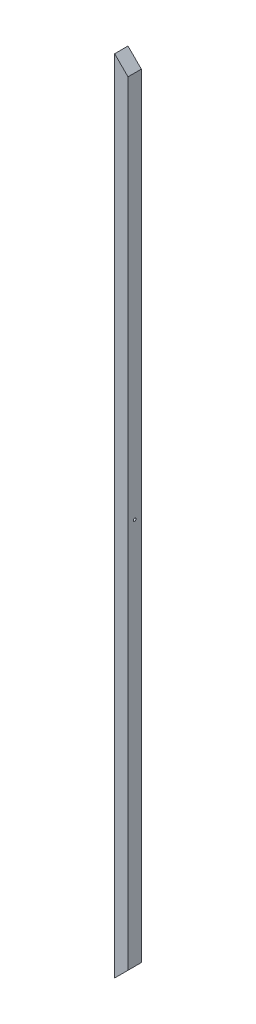
ISO-10303-21;
HEADER;
FILE_DESCRIPTION(('STEP AP214'),'2;1');
FILE_NAME('part.step','',(''),(''),'','','');
FILE_SCHEMA(('AUTOMOTIVE_DESIGN { 1 0 10303 214 1 1 1 1 }'));
ENDSEC;
DATA;
#1=APPLICATION_CONTEXT('core data for automotive mechanical design processes');
#2=APPLICATION_PROTOCOL_DEFINITION('international standard','automotive_design',2000,#1);
#3=PRODUCT_CONTEXT('',#1,'mechanical');
#4=PRODUCT('Part','Part','',(#3));
#5=PRODUCT_RELATED_PRODUCT_CATEGORY('part','',(#4));
#6=PRODUCT_DEFINITION_FORMATION('','',#4);
#7=PRODUCT_DEFINITION_CONTEXT('part definition',#1,'design');
#8=PRODUCT_DEFINITION('design','',#6,#7);
#9=PRODUCT_DEFINITION_SHAPE('','',#8);
#10=(LENGTH_UNIT() NAMED_UNIT(*) SI_UNIT(.MILLI.,.METRE.));
#11=(NAMED_UNIT(*) PLANE_ANGLE_UNIT() SI_UNIT($,.RADIAN.));
#12=(NAMED_UNIT(*) SI_UNIT($,.STERADIAN.) SOLID_ANGLE_UNIT());
#13=UNCERTAINTY_MEASURE_WITH_UNIT(LENGTH_MEASURE(1.E-05),#10,'distance_accuracy_value','');
#14=(GEOMETRIC_REPRESENTATION_CONTEXT(3) GLOBAL_UNCERTAINTY_ASSIGNED_CONTEXT((#13)) GLOBAL_UNIT_ASSIGNED_CONTEXT((#10,
#11,#12)) REPRESENTATION_CONTEXT('',''));
#15=CARTESIAN_POINT('',(0.,0.,0.));
#16=DIRECTION('',(0.,0.,1.));
#17=DIRECTION('',(1.,0.,0.));
#18=AXIS2_PLACEMENT_3D('',#15,#16,#17);
#19=CARTESIAN_POINT('',(-25.,3000.,-25.));
#20=DIRECTION('',(1.,0.,0.));
#21=DIRECTION('',(0.,0.,-1.));
#22=AXIS2_PLACEMENT_3D('',#19,#20,#21);
#23=PLANE('',#22);
#24=CARTESIAN_POINT('',(-25.,1500.,0.));
#25=DIRECTION('',(-1.,0.,0.));
#26=DIRECTION('',(0.,0.,1.));
#27=AXIS2_PLACEMENT_3D('',#24,#25,#26);
#28=CIRCLE('',#27,5.);
#29=CARTESIAN_POINT('',(-25.,1500.,5.));
#30=VERTEX_POINT('',#29);
#31=EDGE_CURVE('E137',#30,#30,#28,.T.);
#32=ORIENTED_EDGE('',*,*,#31,.F.);
#33=EDGE_LOOP('',(#32));
#34=FACE_BOUND('',#33,.T.);
#35=DIRECTION('',(0.,0.,1.));
#36=VECTOR('',#35,1.);
#37=CARTESIAN_POINT('',(-25.,0.,-25.));
#38=LINE('',#37,#36);
#39=CARTESIAN_POINT('',(-25.,0.,-24.9999999999999));
#40=VERTEX_POINT('',#39);
#41=CARTESIAN_POINT('',(-25.,0.,25.));
#42=VERTEX_POINT('',#41);
#43=EDGE_CURVE('E85',#40,#42,#38,.T.);
#44=ORIENTED_EDGE('',*,*,#43,.T.);
#45=DIRECTION('',(0.,-1.,0.));
#46=VECTOR('',#45,1.);
#47=CARTESIAN_POINT('',(-25.,3000.,25.));
#48=LINE('',#47,#46);
#49=CARTESIAN_POINT('',(-25.,3000.,25.));
#50=VERTEX_POINT('',#49);
#51=EDGE_CURVE('E11',#50,#42,#48,.T.);
#52=ORIENTED_EDGE('',*,*,#51,.F.);
#53=DIRECTION('',(0.,0.,1.));
#54=VECTOR('',#53,1.);
#55=CARTESIAN_POINT('',(-25.,3000.,-25.));
#56=LINE('',#55,#54);
#57=CARTESIAN_POINT('',(-25.,3000.,-25.));
#58=VERTEX_POINT('',#57);
#59=EDGE_CURVE('E76',#58,#50,#56,.T.);
#60=ORIENTED_EDGE('',*,*,#59,.F.);
#61=DIRECTION('',(0.,-1.,0.));
#62=VECTOR('',#61,1.);
#63=CARTESIAN_POINT('',(-25.,3000.,-25.));
#64=LINE('',#63,#62);
#65=EDGE_CURVE('E84',#58,#40,#64,.T.);
#66=ORIENTED_EDGE('',*,*,#65,.T.);
#67=EDGE_LOOP('',(#44,#52,#60,#66));
#68=FACE_BOUND('',#67,.T.);
#69=ADVANCED_FACE('F42',(#34,#68),#23,.F.);
#70=CARTESIAN_POINT('',(25.,3000.,25.));
#71=DIRECTION('',(0.,0.,-1.));
#72=DIRECTION('',(-1.,0.,0.));
#73=AXIS2_PLACEMENT_3D('',#70,#71,#72);
#74=PLANE('',#73);
#75=DIRECTION('',(0.,-1.,0.));
#76=VECTOR('',#75,1.);
#77=CARTESIAN_POINT('',(25.,3000.,25.));
#78=LINE('',#77,#76);
#79=CARTESIAN_POINT('',(25.,2950.,25.));
#80=VERTEX_POINT('',#79);
#81=CARTESIAN_POINT('',(25.0000000000002,50.0000000000006,25.));
#82=VERTEX_POINT('',#81);
#83=EDGE_CURVE('E50',#80,#82,#78,.T.);
#84=ORIENTED_EDGE('',*,*,#83,.F.);
#85=DIRECTION('',(0.707106781186552,-0.707106781186543,0.));
#86=VECTOR('',#85,1.);
#87=CARTESIAN_POINT('',(-25.,3000.,25.));
#88=LINE('',#87,#86);
#89=EDGE_CURVE('E79',#50,#80,#88,.T.);
#90=ORIENTED_EDGE('',*,*,#89,.F.);
#91=ORIENTED_EDGE('',*,*,#51,.T.);
#92=DIRECTION('',(-0.707106781186544,-0.707106781186551,0.));
#93=VECTOR('',#92,1.);
#94=CARTESIAN_POINT('',(-25.,0.,25.));
#95=LINE('',#94,#93);
#96=EDGE_CURVE('E94',#82,#42,#95,.T.);
#97=ORIENTED_EDGE('',*,*,#96,.F.);
#98=EDGE_LOOP('',(#84,#90,#91,#97));
#99=FACE_BOUND('',#98,.T.);
#100=ADVANCED_FACE('F89',(#99),#74,.F.);
#101=CARTESIAN_POINT('',(25.,3000.,-25.));
#102=DIRECTION('',(-1.,0.,0.));
#103=DIRECTION('',(0.,0.,1.));
#104=AXIS2_PLACEMENT_3D('',#101,#102,#103);
#105=PLANE('',#104);
#106=CARTESIAN_POINT('',(25.,1500.,0.));
#107=DIRECTION('',(-1.,0.,0.));
#108=DIRECTION('',(0.,0.,1.));
#109=AXIS2_PLACEMENT_3D('',#106,#107,#108);
#110=CIRCLE('',#109,5.);
#111=CARTESIAN_POINT('',(25.,1500.,5.));
#112=VERTEX_POINT('',#111);
#113=EDGE_CURVE('E115',#112,#112,#110,.T.);
#114=ORIENTED_EDGE('',*,*,#113,.T.);
#115=EDGE_LOOP('',(#114));
#116=FACE_BOUND('',#115,.T.);
#117=DIRECTION('',(0.,-1.,0.));
#118=VECTOR('',#117,1.);
#119=CARTESIAN_POINT('',(25.,3000.,-25.));
#120=LINE('',#119,#118);
#121=CARTESIAN_POINT('',(25.,2950.,-24.9999999999999));
#122=VERTEX_POINT('',#121);
#123=CARTESIAN_POINT('',(25.0000000000002,50.0000000000006,-24.9999999999999));
#124=VERTEX_POINT('',#123);
#125=EDGE_CURVE('E103',#122,#124,#120,.T.);
#126=ORIENTED_EDGE('',*,*,#125,.F.);
#127=DIRECTION('',(0.,0.,1.));
#128=VECTOR('',#127,1.);
#129=CARTESIAN_POINT('',(25.,2950.,-2975.));
#130=LINE('',#129,#128);
#131=EDGE_CURVE('E93',#122,#80,#130,.T.);
#132=ORIENTED_EDGE('',*,*,#131,.T.);
#133=ORIENTED_EDGE('',*,*,#83,.T.);
#134=DIRECTION('',(0.,0.,1.));
#135=VECTOR('',#134,1.);
#136=CARTESIAN_POINT('',(25.0000000000002,50.0000000000006,-2975.));
#137=LINE('',#136,#135);
#138=EDGE_CURVE('E109',#124,#82,#137,.T.);
#139=ORIENTED_EDGE('',*,*,#138,.F.);
#140=EDGE_LOOP('',(#126,#132,#133,#139));
#141=FACE_BOUND('',#140,.T.);
#142=ADVANCED_FACE('F108',(#116,#141),#105,.F.);
#143=CARTESIAN_POINT('',(25.,3000.,-25.));
#144=DIRECTION('',(0.,0.,1.));
#145=DIRECTION('',(1.,0.,0.));
#146=AXIS2_PLACEMENT_3D('',#143,#144,#145);
#147=PLANE('',#146);
#148=ORIENTED_EDGE('',*,*,#65,.F.);
#149=DIRECTION('',(0.707106781186552,-0.707106781186543,0.));
#150=VECTOR('',#149,1.);
#151=CARTESIAN_POINT('',(3.08780778723872E-13,2975.,-25.));
#152=LINE('',#151,#150);
#153=EDGE_CURVE('E56',#58,#122,#152,.T.);
#154=ORIENTED_EDGE('',*,*,#153,.T.);
#155=ORIENTED_EDGE('',*,*,#125,.T.);
#156=DIRECTION('',(-0.707106781186544,-0.707106781186551,0.));
#157=VECTOR('',#156,1.);
#158=CARTESIAN_POINT('',(1500.,1525.00000000001,-25.));
#159=LINE('',#158,#157);
#160=EDGE_CURVE('E99',#124,#40,#159,.T.);
#161=ORIENTED_EDGE('',*,*,#160,.T.);
#162=EDGE_LOOP('',(#148,#154,#155,#161));
#163=FACE_BOUND('',#162,.T.);
#164=ADVANCED_FACE('F118',(#163),#147,.F.);
#165=CARTESIAN_POINT('',(-25.,0.,-2975.));
#166=DIRECTION('',(-0.707106781186551,0.707106781186544,0.));
#167=DIRECTION('',(-0.707106781186544,-0.707106781186551,0.));
#168=AXIS2_PLACEMENT_3D('',#165,#166,#167);
#169=PLANE('',#168);
#170=ORIENTED_EDGE('',*,*,#138,.T.);
#171=ORIENTED_EDGE('',*,*,#96,.T.);
#172=ORIENTED_EDGE('',*,*,#43,.F.);
#173=ORIENTED_EDGE('',*,*,#160,.F.);
#174=EDGE_LOOP('',(#170,#171,#172,#173));
#175=FACE_BOUND('',#174,.T.);
#176=ADVANCED_FACE('F116',(#175),#169,.F.);
#177=CARTESIAN_POINT('',(-25.,3000.,-2975.));
#178=DIRECTION('',(-0.707106781186543,-0.707106781186552,0.));
#179=DIRECTION('',(0.707106781186552,-0.707106781186543,0.));
#180=AXIS2_PLACEMENT_3D('',#177,#178,#179);
#181=PLANE('',#180);
#182=ORIENTED_EDGE('',*,*,#59,.T.);
#183=ORIENTED_EDGE('',*,*,#89,.T.);
#184=ORIENTED_EDGE('',*,*,#131,.F.);
#185=ORIENTED_EDGE('',*,*,#153,.F.);
#186=EDGE_LOOP('',(#182,#183,#184,#185));
#187=FACE_BOUND('',#186,.T.);
#188=ADVANCED_FACE('F78',(#187),#181,.F.);
#189=CARTESIAN_POINT('',(25.,1500.,0.));
#190=DIRECTION('',(-1.,0.,0.));
#191=DIRECTION('',(0.,0.,1.));
#192=AXIS2_PLACEMENT_3D('',#189,#190,#191);
#193=CYLINDRICAL_SURFACE('',#192,5.);
#194=ORIENTED_EDGE('',*,*,#113,.F.);
#195=EDGE_LOOP('',(#194));
#196=FACE_BOUND('',#195,.T.);
#197=ORIENTED_EDGE('',*,*,#31,.T.);
#198=EDGE_LOOP('',(#197));
#199=FACE_BOUND('',#198,.T.);
#200=ADVANCED_FACE('F143',(#196,#199),#193,.F.);
#201=CLOSED_SHELL('',(#69,#100,#142,#164,#176,#188,#200));
#202=MANIFOLD_SOLID_BREP('B2',#201);
#203=ADVANCED_BREP_SHAPE_REPRESENTATION('',(#18,#202),#14);
#204=SHAPE_DEFINITION_REPRESENTATION(#9,#203);
ENDSEC;
END-ISO-10303-21;
